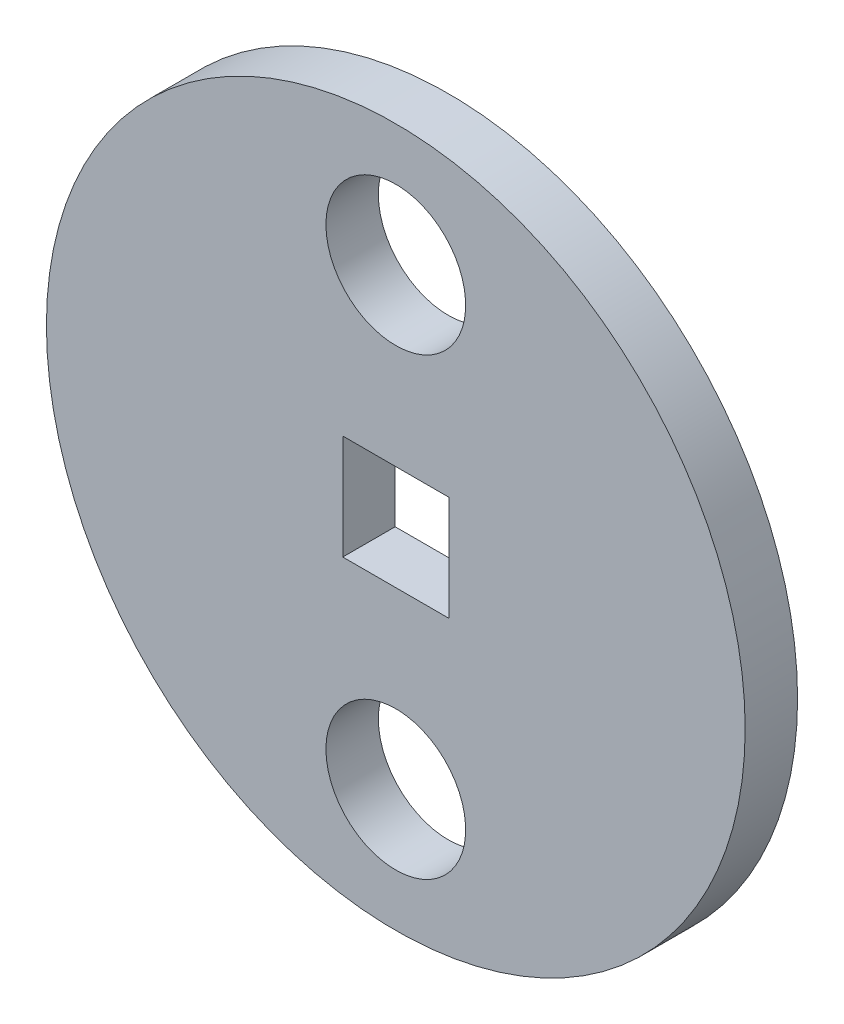
ISO-10303-21;
HEADER;
FILE_DESCRIPTION(('STEP AP214'),'2;1');
FILE_NAME('part.step','',(''),(''),'','','');
FILE_SCHEMA(('AUTOMOTIVE_DESIGN { 1 0 10303 214 1 1 1 1 }'));
ENDSEC;
DATA;
#1=APPLICATION_CONTEXT('core data for automotive mechanical design processes');
#2=APPLICATION_PROTOCOL_DEFINITION('international standard','automotive_design',2000,#1);
#3=PRODUCT_CONTEXT('',#1,'mechanical');
#4=PRODUCT('Part','Part','',(#3));
#5=PRODUCT_RELATED_PRODUCT_CATEGORY('part','',(#4));
#6=PRODUCT_DEFINITION_FORMATION('','',#4);
#7=PRODUCT_DEFINITION_CONTEXT('part definition',#1,'design');
#8=PRODUCT_DEFINITION('design','',#6,#7);
#9=PRODUCT_DEFINITION_SHAPE('','',#8);
#10=(LENGTH_UNIT() NAMED_UNIT(*) SI_UNIT(.MILLI.,.METRE.));
#11=(NAMED_UNIT(*) PLANE_ANGLE_UNIT() SI_UNIT($,.RADIAN.));
#12=(NAMED_UNIT(*) SI_UNIT($,.STERADIAN.) SOLID_ANGLE_UNIT());
#13=UNCERTAINTY_MEASURE_WITH_UNIT(LENGTH_MEASURE(1.E-05),#10,'distance_accuracy_value','');
#14=(GEOMETRIC_REPRESENTATION_CONTEXT(3) GLOBAL_UNCERTAINTY_ASSIGNED_CONTEXT((#13)) GLOBAL_UNIT_ASSIGNED_CONTEXT((#10,
#11,#12)) REPRESENTATION_CONTEXT('',''));
#15=CARTESIAN_POINT('',(0.,0.,0.));
#16=DIRECTION('',(0.,0.,1.));
#17=DIRECTION('',(1.,0.,0.));
#18=AXIS2_PLACEMENT_3D('',#15,#16,#17);
#19=CARTESIAN_POINT('',(0.,0.,3.81));
#20=DIRECTION('',(0.,0.,1.));
#21=DIRECTION('',(1.,0.,0.));
#22=AXIS2_PLACEMENT_3D('',#19,#20,#21);
#23=PLANE('',#22);
#24=CARTESIAN_POINT('',(0.,16.51,3.81));
#25=DIRECTION('',(0.,0.,1.));
#26=DIRECTION('',(1.,0.,0.));
#27=AXIS2_PLACEMENT_3D('',#24,#25,#26);
#28=CIRCLE('',#27,5.08);
#29=CARTESIAN_POINT('',(-5.08,16.51,3.81));
#30=VERTEX_POINT('',#29);
#31=EDGE_CURVE('E102',#30,#30,#28,.T.);
#32=ORIENTED_EDGE('',*,*,#31,.F.);
#33=EDGE_LOOP('',(#32));
#34=FACE_BOUND('',#33,.T.);
#35=CARTESIAN_POINT('',(0.,0.,3.81));
#36=DIRECTION('',(0.,0.,1.));
#37=DIRECTION('',(1.,0.,0.));
#38=AXIS2_PLACEMENT_3D('',#35,#36,#37);
#39=CIRCLE('',#38,25.4);
#40=CARTESIAN_POINT('',(-25.4,0.,3.81));
#41=VERTEX_POINT('',#40);
#42=EDGE_CURVE('E11',#41,#41,#39,.T.);
#43=ORIENTED_EDGE('',*,*,#42,.T.);
#44=EDGE_LOOP('',(#43));
#45=FACE_BOUND('',#44,.T.);
#46=DIRECTION('',(-1.,0.,0.));
#47=VECTOR('',#46,1.);
#48=CARTESIAN_POINT('',(-3.8553001339101,3.81,3.81));
#49=LINE('',#48,#47);
#50=CARTESIAN_POINT('',(3.8553001339101,3.81,3.81));
#51=VERTEX_POINT('',#50);
#52=CARTESIAN_POINT('',(-3.8553001339101,3.81,3.81));
#53=VERTEX_POINT('',#52);
#54=EDGE_CURVE('E82',#51,#53,#49,.T.);
#55=ORIENTED_EDGE('',*,*,#54,.F.);
#56=DIRECTION('',(0.,1.,0.));
#57=VECTOR('',#56,1.);
#58=CARTESIAN_POINT('',(3.8553001339101,3.81,3.81));
#59=LINE('',#58,#57);
#60=CARTESIAN_POINT('',(3.8553001339101,-3.81,3.81));
#61=VERTEX_POINT('',#60);
#62=EDGE_CURVE('E74',#61,#51,#59,.T.);
#63=ORIENTED_EDGE('',*,*,#62,.F.);
#64=DIRECTION('',(1.,0.,0.));
#65=VECTOR('',#64,1.);
#66=CARTESIAN_POINT('',(-3.8553001339101,-3.81,3.81));
#67=LINE('',#66,#65);
#68=CARTESIAN_POINT('',(-3.8553001339101,-3.81,3.81));
#69=VERTEX_POINT('',#68);
#70=EDGE_CURVE('E96',#69,#61,#67,.T.);
#71=ORIENTED_EDGE('',*,*,#70,.F.);
#72=DIRECTION('',(0.,-1.,0.));
#73=VECTOR('',#72,1.);
#74=CARTESIAN_POINT('',(-3.8553001339101,3.81,3.81));
#75=LINE('',#74,#73);
#76=EDGE_CURVE('E94',#53,#69,#75,.T.);
#77=ORIENTED_EDGE('',*,*,#76,.F.);
#78=EDGE_LOOP('',(#55,#63,#71,#77));
#79=FACE_BOUND('',#78,.T.);
#80=CARTESIAN_POINT('',(-1.11258653325771E-13,-16.51,3.81));
#81=DIRECTION('',(0.,0.,1.));
#82=DIRECTION('',(1.,0.,0.));
#83=AXIS2_PLACEMENT_3D('',#80,#81,#82);
#84=CIRCLE('',#83,5.08);
#85=CARTESIAN_POINT('',(-5.08000000000011,-16.51,3.81));
#86=VERTEX_POINT('',#85);
#87=EDGE_CURVE('E177',#86,#86,#84,.T.);
#88=ORIENTED_EDGE('',*,*,#87,.F.);
#89=EDGE_LOOP('',(#88));
#90=FACE_BOUND('',#89,.T.);
#91=ADVANCED_FACE('F33',(#34,#45,#79,#90),#23,.T.);
#92=CARTESIAN_POINT('',(0.,0.,0.));
#93=DIRECTION('',(0.,0.,1.));
#94=DIRECTION('',(1.,0.,0.));
#95=AXIS2_PLACEMENT_3D('',#92,#93,#94);
#96=PLANE('',#95);
#97=CARTESIAN_POINT('',(0.,0.,0.));
#98=DIRECTION('',(0.,0.,1.));
#99=DIRECTION('',(1.,0.,0.));
#100=AXIS2_PLACEMENT_3D('',#97,#98,#99);
#101=CIRCLE('',#100,25.4);
#102=CARTESIAN_POINT('',(-25.4,0.,0.));
#103=VERTEX_POINT('',#102);
#104=EDGE_CURVE('E37',#103,#103,#101,.T.);
#105=ORIENTED_EDGE('',*,*,#104,.F.);
#106=EDGE_LOOP('',(#105));
#107=FACE_BOUND('',#106,.T.);
#108=DIRECTION('',(0.,1.,0.));
#109=VECTOR('',#108,1.);
#110=CARTESIAN_POINT('',(3.8553001339101,3.81,0.));
#111=LINE('',#110,#109);
#112=CARTESIAN_POINT('',(3.8553001339101,-3.81,0.));
#113=VERTEX_POINT('',#112);
#114=CARTESIAN_POINT('',(3.8553001339101,3.81,0.));
#115=VERTEX_POINT('',#114);
#116=EDGE_CURVE('E56',#113,#115,#111,.T.);
#117=ORIENTED_EDGE('',*,*,#116,.T.);
#118=DIRECTION('',(-1.,0.,0.));
#119=VECTOR('',#118,1.);
#120=CARTESIAN_POINT('',(-3.8553001339101,3.81,0.));
#121=LINE('',#120,#119);
#122=CARTESIAN_POINT('',(-3.8553001339101,3.81,0.));
#123=VERTEX_POINT('',#122);
#124=EDGE_CURVE('E89',#115,#123,#121,.T.);
#125=ORIENTED_EDGE('',*,*,#124,.T.);
#126=DIRECTION('',(0.,-1.,0.));
#127=VECTOR('',#126,1.);
#128=CARTESIAN_POINT('',(-3.8553001339101,3.81,0.));
#129=LINE('',#128,#127);
#130=CARTESIAN_POINT('',(-3.8553001339101,-3.81,0.));
#131=VERTEX_POINT('',#130);
#132=EDGE_CURVE('E104',#123,#131,#129,.T.);
#133=ORIENTED_EDGE('',*,*,#132,.T.);
#134=DIRECTION('',(1.,0.,0.));
#135=VECTOR('',#134,1.);
#136=CARTESIAN_POINT('',(-3.8553001339101,-3.81,0.));
#137=LINE('',#136,#135);
#138=EDGE_CURVE('E83',#131,#113,#137,.T.);
#139=ORIENTED_EDGE('',*,*,#138,.T.);
#140=EDGE_LOOP('',(#117,#125,#133,#139));
#141=FACE_BOUND('',#140,.T.);
#142=CARTESIAN_POINT('',(0.,16.51,0.));
#143=DIRECTION('',(0.,0.,1.));
#144=DIRECTION('',(1.,0.,0.));
#145=AXIS2_PLACEMENT_3D('',#142,#143,#144);
#146=CIRCLE('',#145,5.08);
#147=CARTESIAN_POINT('',(-5.08,16.51,0.));
#148=VERTEX_POINT('',#147);
#149=EDGE_CURVE('E183',#148,#148,#146,.T.);
#150=ORIENTED_EDGE('',*,*,#149,.T.);
#151=EDGE_LOOP('',(#150));
#152=FACE_BOUND('',#151,.T.);
#153=CARTESIAN_POINT('',(-1.11258653325771E-13,-16.51,0.));
#154=DIRECTION('',(0.,0.,1.));
#155=DIRECTION('',(1.,0.,0.));
#156=AXIS2_PLACEMENT_3D('',#153,#154,#155);
#157=CIRCLE('',#156,5.08);
#158=CARTESIAN_POINT('',(-5.08000000000011,-16.51,0.));
#159=VERTEX_POINT('',#158);
#160=EDGE_CURVE('E180',#159,#159,#157,.T.);
#161=ORIENTED_EDGE('',*,*,#160,.T.);
#162=EDGE_LOOP('',(#161));
#163=FACE_BOUND('',#162,.T.);
#164=ADVANCED_FACE('F115',(#107,#141,#152,#163),#96,.F.);
#165=CARTESIAN_POINT('',(0.,0.,3.81));
#166=DIRECTION('',(0.,0.,-1.));
#167=DIRECTION('',(-1.,0.,0.));
#168=AXIS2_PLACEMENT_3D('',#165,#166,#167);
#169=CYLINDRICAL_SURFACE('',#168,25.4);
#170=CARTESIAN_POINT('',(-25.4,0.,3.81));
#171=CARTESIAN_POINT('',(-25.4,0.,3.7703125));
#172=CARTESIAN_POINT('',(-25.4,0.,3.730625));
#173=CARTESIAN_POINT('',(-25.4,0.,3.65125));
#174=CARTESIAN_POINT('',(-25.4,0.,3.6115625));
#175=CARTESIAN_POINT('',(-25.4,0.,3.5321875));
#176=CARTESIAN_POINT('',(-25.4,0.,3.4925));
#177=CARTESIAN_POINT('',(-25.4,0.,3.413125));
#178=CARTESIAN_POINT('',(-25.4,0.,3.3734375));
#179=CARTESIAN_POINT('',(-25.4,0.,3.2940625));
#180=CARTESIAN_POINT('',(-25.4,0.,3.254375));
#181=CARTESIAN_POINT('',(-25.4,0.,3.175));
#182=CARTESIAN_POINT('',(-25.4,0.,3.1353125));
#183=CARTESIAN_POINT('',(-25.4,0.,3.0559375));
#184=CARTESIAN_POINT('',(-25.4,0.,3.01625));
#185=CARTESIAN_POINT('',(-25.4,0.,2.936875));
#186=CARTESIAN_POINT('',(-25.4,0.,2.8971875));
#187=CARTESIAN_POINT('',(-25.4,0.,2.8178125));
#188=CARTESIAN_POINT('',(-25.4,0.,2.778125));
#189=CARTESIAN_POINT('',(-25.4,0.,2.69875));
#190=CARTESIAN_POINT('',(-25.4,0.,2.6590625));
#191=CARTESIAN_POINT('',(-25.4,0.,2.5796875));
#192=CARTESIAN_POINT('',(-25.4,0.,2.54));
#193=CARTESIAN_POINT('',(-25.4,0.,2.460625));
#194=CARTESIAN_POINT('',(-25.4,0.,2.4209375));
#195=CARTESIAN_POINT('',(-25.4,0.,2.3415625));
#196=CARTESIAN_POINT('',(-25.4,0.,2.301875));
#197=CARTESIAN_POINT('',(-25.4,0.,2.2225));
#198=CARTESIAN_POINT('',(-25.4,0.,2.1828125));
#199=CARTESIAN_POINT('',(-25.4,0.,2.1034375));
#200=CARTESIAN_POINT('',(-25.4,0.,2.06375));
#201=CARTESIAN_POINT('',(-25.4,0.,1.984375));
#202=CARTESIAN_POINT('',(-25.4,0.,1.9446875));
#203=CARTESIAN_POINT('',(-25.4,0.,1.8653125));
#204=CARTESIAN_POINT('',(-25.4,0.,1.825625));
#205=CARTESIAN_POINT('',(-25.4,0.,1.74625));
#206=CARTESIAN_POINT('',(-25.4,0.,1.7065625));
#207=CARTESIAN_POINT('',(-25.4,0.,1.6271875));
#208=CARTESIAN_POINT('',(-25.4,0.,1.5875));
#209=CARTESIAN_POINT('',(-25.4,0.,1.508125));
#210=CARTESIAN_POINT('',(-25.4,0.,1.4684375));
#211=CARTESIAN_POINT('',(-25.4,0.,1.3890625));
#212=CARTESIAN_POINT('',(-25.4,0.,1.349375));
#213=CARTESIAN_POINT('',(-25.4,0.,1.27));
#214=CARTESIAN_POINT('',(-25.4,0.,1.2303125));
#215=CARTESIAN_POINT('',(-25.4,0.,1.1509375));
#216=CARTESIAN_POINT('',(-25.4,0.,1.11125));
#217=CARTESIAN_POINT('',(-25.4,0.,1.031875));
#218=CARTESIAN_POINT('',(-25.4,0.,0.9921875));
#219=CARTESIAN_POINT('',(-25.4,0.,0.9128125));
#220=CARTESIAN_POINT('',(-25.4,0.,0.873125));
#221=CARTESIAN_POINT('',(-25.4,0.,0.79375));
#222=CARTESIAN_POINT('',(-25.4,0.,0.7540625));
#223=CARTESIAN_POINT('',(-25.4,0.,0.6746875));
#224=CARTESIAN_POINT('',(-25.4,0.,0.635));
#225=CARTESIAN_POINT('',(-25.4,0.,0.555625));
#226=CARTESIAN_POINT('',(-25.4,0.,0.5159375));
#227=CARTESIAN_POINT('',(-25.4,0.,0.4365625));
#228=CARTESIAN_POINT('',(-25.4,0.,0.396875));
#229=CARTESIAN_POINT('',(-25.4,0.,0.3175));
#230=CARTESIAN_POINT('',(-25.4,0.,0.2778125));
#231=CARTESIAN_POINT('',(-25.4,0.,0.1984375));
#232=CARTESIAN_POINT('',(-25.4,0.,0.15875));
#233=CARTESIAN_POINT('',(-25.4,0.,0.0793749999999999));
#234=CARTESIAN_POINT('',(-25.4,0.,0.0396874999999999));
#235=CARTESIAN_POINT('',(-25.4,0.,0.));
#236=B_SPLINE_CURVE_WITH_KNOTS('',3,(#170,#171,#172,#173,#174,#175,#176,#177,#178,#179,#180,
#181,#182,#183,#184,#185,#186,#187,#188,#189,#190,#191,#192,#193,#194,#195,#196,#197,#198,#199,
#200,#201,#202,#203,#204,#205,#206,#207,#208,#209,#210,#211,#212,#213,#214,#215,#216,#217,#218,
#219,#220,#221,#222,#223,#224,#225,#226,#227,#228,#229,#230,#231,#232,#233,#234,#235),
.UNSPECIFIED.,.F.,.F.,(4,2,2,2,2,2,2,2,2,2,2,2,2,2,2,2,2,2,2,2,2,2,2,2,2,2,2,2,2,2,2,2,4),(0.,
0.1190625,0.238125,0.3571875,0.47625,0.595312499999999,0.714375,0.833437499999999,
0.952499999999999,1.0715625,1.190625,1.3096875,1.42875,1.5478125,1.666875,1.7859375,1.905,
2.0240625,2.143125,2.2621875,2.38125,2.5003125,2.619375,2.7384375,2.8575,2.9765625,3.095625,
3.2146875,3.33375,3.4528125,3.571875,3.6909375,3.81),.UNSPECIFIED.);
#237=EDGE_CURVE('BSEAM35',#41,#103,#236,.T.);
#238=ORIENTED_EDGE('',*,*,#42,.F.);
#239=ORIENTED_EDGE('',*,*,#104,.T.);
#240=ORIENTED_EDGE('',*,*,#237,.T.);
#241=ORIENTED_EDGE('',*,*,#237,.F.);
#242=EDGE_LOOP('',(#238,#240,#239,#241));
#243=FACE_BOUND('',#242,.T.);
#244=ADVANCED_FACE('F35',(#243),#169,.T.);
#245=CARTESIAN_POINT('',(3.8553001339101,3.81,3.81));
#246=DIRECTION('',(-1.,0.,0.));
#247=DIRECTION('',(0.,-1.,0.));
#248=AXIS2_PLACEMENT_3D('',#245,#246,#247);
#249=PLANE('',#248);
#250=ORIENTED_EDGE('',*,*,#116,.F.);
#251=DIRECTION('',(0.,0.,-1.));
#252=VECTOR('',#251,1.);
#253=CARTESIAN_POINT('',(3.8553001339101,-3.81,3.81));
#254=LINE('',#253,#252);
#255=EDGE_CURVE('E78',#61,#113,#254,.T.);
#256=ORIENTED_EDGE('',*,*,#255,.F.);
#257=ORIENTED_EDGE('',*,*,#62,.T.);
#258=DIRECTION('',(0.,0.,-1.));
#259=VECTOR('',#258,1.);
#260=CARTESIAN_POINT('',(3.8553001339101,3.81,3.81));
#261=LINE('',#260,#259);
#262=EDGE_CURVE('E77',#51,#115,#261,.T.);
#263=ORIENTED_EDGE('',*,*,#262,.T.);
#264=EDGE_LOOP('',(#250,#256,#257,#263));
#265=FACE_BOUND('',#264,.T.);
#266=ADVANCED_FACE('F76',(#265),#249,.T.);
#267=CARTESIAN_POINT('',(-3.8553001339101,3.81,3.81));
#268=DIRECTION('',(0.,-1.,0.));
#269=DIRECTION('',(0.,0.,-1.));
#270=AXIS2_PLACEMENT_3D('',#267,#268,#269);
#271=PLANE('',#270);
#272=ORIENTED_EDGE('',*,*,#124,.F.);
#273=ORIENTED_EDGE('',*,*,#262,.F.);
#274=ORIENTED_EDGE('',*,*,#54,.T.);
#275=DIRECTION('',(0.,0.,-1.));
#276=VECTOR('',#275,1.);
#277=CARTESIAN_POINT('',(-3.8553001339101,3.81,3.81));
#278=LINE('',#277,#276);
#279=EDGE_CURVE('E90',#53,#123,#278,.T.);
#280=ORIENTED_EDGE('',*,*,#279,.T.);
#281=EDGE_LOOP('',(#272,#273,#274,#280));
#282=FACE_BOUND('',#281,.T.);
#283=ADVANCED_FACE('F86',(#282),#271,.T.);
#284=CARTESIAN_POINT('',(-3.8553001339101,3.81,3.81));
#285=DIRECTION('',(1.,0.,0.));
#286=DIRECTION('',(0.,1.,0.));
#287=AXIS2_PLACEMENT_3D('',#284,#285,#286);
#288=PLANE('',#287);
#289=ORIENTED_EDGE('',*,*,#132,.F.);
#290=ORIENTED_EDGE('',*,*,#279,.F.);
#291=ORIENTED_EDGE('',*,*,#76,.T.);
#292=DIRECTION('',(0.,0.,-1.));
#293=VECTOR('',#292,1.);
#294=CARTESIAN_POINT('',(-3.8553001339101,-3.81,3.81));
#295=LINE('',#294,#293);
#296=EDGE_CURVE('E48',#69,#131,#295,.T.);
#297=ORIENTED_EDGE('',*,*,#296,.T.);
#298=EDGE_LOOP('',(#289,#290,#291,#297));
#299=FACE_BOUND('',#298,.T.);
#300=ADVANCED_FACE('F113',(#299),#288,.T.);
#301=CARTESIAN_POINT('',(-3.8553001339101,-3.81,3.81));
#302=DIRECTION('',(0.,1.,0.));
#303=DIRECTION('',(0.,0.,1.));
#304=AXIS2_PLACEMENT_3D('',#301,#302,#303);
#305=PLANE('',#304);
#306=ORIENTED_EDGE('',*,*,#138,.F.);
#307=ORIENTED_EDGE('',*,*,#296,.F.);
#308=ORIENTED_EDGE('',*,*,#70,.T.);
#309=ORIENTED_EDGE('',*,*,#255,.T.);
#310=EDGE_LOOP('',(#306,#307,#308,#309));
#311=FACE_BOUND('',#310,.T.);
#312=ADVANCED_FACE('F117',(#311),#305,.T.);
#313=CARTESIAN_POINT('',(0.,16.51,3.81));
#314=DIRECTION('',(0.,0.,-1.));
#315=DIRECTION('',(-1.,0.,0.));
#316=AXIS2_PLACEMENT_3D('',#313,#314,#315);
#317=CYLINDRICAL_SURFACE('',#316,5.08);
#318=CARTESIAN_POINT('',(-5.08,16.51,3.81));
#319=CARTESIAN_POINT('',(-5.08,16.51,3.7703125));
#320=CARTESIAN_POINT('',(-5.08,16.51,3.730625));
#321=CARTESIAN_POINT('',(-5.08,16.51,3.65125));
#322=CARTESIAN_POINT('',(-5.08,16.51,3.6115625));
#323=CARTESIAN_POINT('',(-5.08,16.51,3.5321875));
#324=CARTESIAN_POINT('',(-5.08,16.51,3.4925));
#325=CARTESIAN_POINT('',(-5.08,16.51,3.413125));
#326=CARTESIAN_POINT('',(-5.08,16.51,3.3734375));
#327=CARTESIAN_POINT('',(-5.08,16.51,3.2940625));
#328=CARTESIAN_POINT('',(-5.08,16.51,3.254375));
#329=CARTESIAN_POINT('',(-5.08,16.51,3.175));
#330=CARTESIAN_POINT('',(-5.08,16.51,3.1353125));
#331=CARTESIAN_POINT('',(-5.08,16.51,3.0559375));
#332=CARTESIAN_POINT('',(-5.08,16.51,3.01625));
#333=CARTESIAN_POINT('',(-5.08,16.51,2.936875));
#334=CARTESIAN_POINT('',(-5.08,16.51,2.8971875));
#335=CARTESIAN_POINT('',(-5.08,16.51,2.8178125));
#336=CARTESIAN_POINT('',(-5.08,16.51,2.778125));
#337=CARTESIAN_POINT('',(-5.08,16.51,2.69875));
#338=CARTESIAN_POINT('',(-5.08,16.51,2.6590625));
#339=CARTESIAN_POINT('',(-5.08,16.51,2.5796875));
#340=CARTESIAN_POINT('',(-5.08,16.51,2.54));
#341=CARTESIAN_POINT('',(-5.08,16.51,2.460625));
#342=CARTESIAN_POINT('',(-5.08,16.51,2.4209375));
#343=CARTESIAN_POINT('',(-5.08,16.51,2.3415625));
#344=CARTESIAN_POINT('',(-5.08,16.51,2.301875));
#345=CARTESIAN_POINT('',(-5.08,16.51,2.2225));
#346=CARTESIAN_POINT('',(-5.08,16.51,2.1828125));
#347=CARTESIAN_POINT('',(-5.08,16.51,2.1034375));
#348=CARTESIAN_POINT('',(-5.08,16.51,2.06375));
#349=CARTESIAN_POINT('',(-5.08,16.51,1.984375));
#350=CARTESIAN_POINT('',(-5.08,16.51,1.9446875));
#351=CARTESIAN_POINT('',(-5.08,16.51,1.8653125));
#352=CARTESIAN_POINT('',(-5.08,16.51,1.825625));
#353=CARTESIAN_POINT('',(-5.08,16.51,1.74625));
#354=CARTESIAN_POINT('',(-5.08,16.51,1.7065625));
#355=CARTESIAN_POINT('',(-5.08,16.51,1.6271875));
#356=CARTESIAN_POINT('',(-5.08,16.51,1.5875));
#357=CARTESIAN_POINT('',(-5.08,16.51,1.508125));
#358=CARTESIAN_POINT('',(-5.08,16.51,1.4684375));
#359=CARTESIAN_POINT('',(-5.08,16.51,1.3890625));
#360=CARTESIAN_POINT('',(-5.08,16.51,1.349375));
#361=CARTESIAN_POINT('',(-5.08,16.51,1.27));
#362=CARTESIAN_POINT('',(-5.08,16.51,1.2303125));
#363=CARTESIAN_POINT('',(-5.08,16.51,1.1509375));
#364=CARTESIAN_POINT('',(-5.08,16.51,1.11125));
#365=CARTESIAN_POINT('',(-5.08,16.51,1.031875));
#366=CARTESIAN_POINT('',(-5.08,16.51,0.9921875));
#367=CARTESIAN_POINT('',(-5.08,16.51,0.9128125));
#368=CARTESIAN_POINT('',(-5.08,16.51,0.873125));
#369=CARTESIAN_POINT('',(-5.08,16.51,0.79375));
#370=CARTESIAN_POINT('',(-5.08,16.51,0.7540625));
#371=CARTESIAN_POINT('',(-5.08,16.51,0.6746875));
#372=CARTESIAN_POINT('',(-5.08,16.51,0.635));
#373=CARTESIAN_POINT('',(-5.08,16.51,0.555625));
#374=CARTESIAN_POINT('',(-5.08,16.51,0.5159375));
#375=CARTESIAN_POINT('',(-5.08,16.51,0.4365625));
#376=CARTESIAN_POINT('',(-5.08,16.51,0.396875));
#377=CARTESIAN_POINT('',(-5.08,16.51,0.3175));
#378=CARTESIAN_POINT('',(-5.08,16.51,0.2778125));
#379=CARTESIAN_POINT('',(-5.08,16.51,0.1984375));
#380=CARTESIAN_POINT('',(-5.08,16.51,0.15875));
#381=CARTESIAN_POINT('',(-5.08,16.51,0.0793749999999999));
#382=CARTESIAN_POINT('',(-5.08,16.51,0.0396874999999999));
#383=CARTESIAN_POINT('',(-5.08,16.51,0.));
#384=B_SPLINE_CURVE_WITH_KNOTS('',3,(#318,#319,#320,#321,#322,#323,#324,#325,#326,#327,#328,
#329,#330,#331,#332,#333,#334,#335,#336,#337,#338,#339,#340,#341,#342,#343,#344,#345,#346,#347,
#348,#349,#350,#351,#352,#353,#354,#355,#356,#357,#358,#359,#360,#361,#362,#363,#364,#365,#366,
#367,#368,#369,#370,#371,#372,#373,#374,#375,#376,#377,#378,#379,#380,#381,#382,#383),
.UNSPECIFIED.,.F.,.F.,(4,2,2,2,2,2,2,2,2,2,2,2,2,2,2,2,2,2,2,2,2,2,2,2,2,2,2,2,2,2,2,2,4),(0.,
0.1190625,0.238125,0.3571875,0.47625,0.5953125,0.714375,0.8334375,0.9525,1.0715625,1.190625,
1.3096875,1.42875,1.5478125,1.666875,1.7859375,1.905,2.0240625,2.143125,2.2621875,2.38125,
2.5003125,2.619375,2.7384375,2.8575,2.9765625,3.095625,3.2146875,3.33375,3.4528125,3.571875,
3.6909375,3.81),.UNSPECIFIED.);
#385=EDGE_CURVE('BSEAM119',#30,#148,#384,.T.);
#386=ORIENTED_EDGE('',*,*,#31,.T.);
#387=ORIENTED_EDGE('',*,*,#149,.F.);
#388=ORIENTED_EDGE('',*,*,#385,.T.);
#389=ORIENTED_EDGE('',*,*,#385,.F.);
#390=EDGE_LOOP('',(#386,#388,#387,#389));
#391=FACE_BOUND('',#390,.T.);
#392=ADVANCED_FACE('F119',(#391),#317,.F.);
#393=CARTESIAN_POINT('',(-1.11258653325771E-13,-16.51,3.81));
#394=DIRECTION('',(0.,0.,-1.));
#395=DIRECTION('',(-1.,0.,0.));
#396=AXIS2_PLACEMENT_3D('',#393,#394,#395);
#397=CYLINDRICAL_SURFACE('',#396,5.08);
#398=CARTESIAN_POINT('',(-5.08000000000011,-16.51,3.81));
#399=CARTESIAN_POINT('',(-5.08000000000011,-16.51,3.7703125));
#400=CARTESIAN_POINT('',(-5.08000000000011,-16.51,3.730625));
#401=CARTESIAN_POINT('',(-5.08000000000011,-16.51,3.65125));
#402=CARTESIAN_POINT('',(-5.08000000000011,-16.51,3.6115625));
#403=CARTESIAN_POINT('',(-5.08000000000011,-16.51,3.5321875));
#404=CARTESIAN_POINT('',(-5.08000000000011,-16.51,3.4925));
#405=CARTESIAN_POINT('',(-5.08000000000011,-16.51,3.413125));
#406=CARTESIAN_POINT('',(-5.08000000000011,-16.51,3.3734375));
#407=CARTESIAN_POINT('',(-5.08000000000011,-16.51,3.2940625));
#408=CARTESIAN_POINT('',(-5.08000000000011,-16.51,3.254375));
#409=CARTESIAN_POINT('',(-5.08000000000011,-16.51,3.175));
#410=CARTESIAN_POINT('',(-5.08000000000011,-16.51,3.1353125));
#411=CARTESIAN_POINT('',(-5.08000000000011,-16.51,3.0559375));
#412=CARTESIAN_POINT('',(-5.08000000000011,-16.51,3.01625));
#413=CARTESIAN_POINT('',(-5.08000000000011,-16.51,2.936875));
#414=CARTESIAN_POINT('',(-5.08000000000011,-16.51,2.8971875));
#415=CARTESIAN_POINT('',(-5.08000000000011,-16.51,2.8178125));
#416=CARTESIAN_POINT('',(-5.08000000000011,-16.51,2.778125));
#417=CARTESIAN_POINT('',(-5.08000000000011,-16.51,2.69875));
#418=CARTESIAN_POINT('',(-5.08000000000011,-16.51,2.6590625));
#419=CARTESIAN_POINT('',(-5.08000000000011,-16.51,2.5796875));
#420=CARTESIAN_POINT('',(-5.08000000000011,-16.51,2.54));
#421=CARTESIAN_POINT('',(-5.08000000000011,-16.51,2.460625));
#422=CARTESIAN_POINT('',(-5.08000000000011,-16.51,2.4209375));
#423=CARTESIAN_POINT('',(-5.08000000000011,-16.51,2.3415625));
#424=CARTESIAN_POINT('',(-5.08000000000011,-16.51,2.301875));
#425=CARTESIAN_POINT('',(-5.08000000000011,-16.51,2.2225));
#426=CARTESIAN_POINT('',(-5.08000000000011,-16.51,2.1828125));
#427=CARTESIAN_POINT('',(-5.08000000000011,-16.51,2.1034375));
#428=CARTESIAN_POINT('',(-5.08000000000011,-16.51,2.06375));
#429=CARTESIAN_POINT('',(-5.08000000000011,-16.51,1.984375));
#430=CARTESIAN_POINT('',(-5.08000000000011,-16.51,1.9446875));
#431=CARTESIAN_POINT('',(-5.08000000000011,-16.51,1.8653125));
#432=CARTESIAN_POINT('',(-5.08000000000011,-16.51,1.825625));
#433=CARTESIAN_POINT('',(-5.08000000000011,-16.51,1.74625));
#434=CARTESIAN_POINT('',(-5.08000000000011,-16.51,1.7065625));
#435=CARTESIAN_POINT('',(-5.08000000000011,-16.51,1.6271875));
#436=CARTESIAN_POINT('',(-5.08000000000011,-16.51,1.5875));
#437=CARTESIAN_POINT('',(-5.08000000000011,-16.51,1.508125));
#438=CARTESIAN_POINT('',(-5.08000000000011,-16.51,1.4684375));
#439=CARTESIAN_POINT('',(-5.08000000000011,-16.51,1.3890625));
#440=CARTESIAN_POINT('',(-5.08000000000011,-16.51,1.349375));
#441=CARTESIAN_POINT('',(-5.08000000000011,-16.51,1.27));
#442=CARTESIAN_POINT('',(-5.08000000000011,-16.51,1.2303125));
#443=CARTESIAN_POINT('',(-5.08000000000011,-16.51,1.1509375));
#444=CARTESIAN_POINT('',(-5.08000000000011,-16.51,1.11125));
#445=CARTESIAN_POINT('',(-5.08000000000011,-16.51,1.031875));
#446=CARTESIAN_POINT('',(-5.08000000000011,-16.51,0.9921875));
#447=CARTESIAN_POINT('',(-5.08000000000011,-16.51,0.9128125));
#448=CARTESIAN_POINT('',(-5.08000000000011,-16.51,0.873125));
#449=CARTESIAN_POINT('',(-5.08000000000011,-16.51,0.79375));
#450=CARTESIAN_POINT('',(-5.08000000000011,-16.51,0.7540625));
#451=CARTESIAN_POINT('',(-5.08000000000011,-16.51,0.6746875));
#452=CARTESIAN_POINT('',(-5.08000000000011,-16.51,0.635));
#453=CARTESIAN_POINT('',(-5.08000000000011,-16.51,0.555625));
#454=CARTESIAN_POINT('',(-5.08000000000011,-16.51,0.5159375));
#455=CARTESIAN_POINT('',(-5.08000000000011,-16.51,0.4365625));
#456=CARTESIAN_POINT('',(-5.08000000000011,-16.51,0.396875));
#457=CARTESIAN_POINT('',(-5.08000000000011,-16.51,0.3175));
#458=CARTESIAN_POINT('',(-5.08000000000011,-16.51,0.2778125));
#459=CARTESIAN_POINT('',(-5.08000000000011,-16.51,0.1984375));
#460=CARTESIAN_POINT('',(-5.08000000000011,-16.51,0.15875));
#461=CARTESIAN_POINT('',(-5.08000000000011,-16.51,0.0793749999999999));
#462=CARTESIAN_POINT('',(-5.08000000000011,-16.51,0.0396874999999999));
#463=CARTESIAN_POINT('',(-5.08000000000011,-16.51,0.));
#464=B_SPLINE_CURVE_WITH_KNOTS('',3,(#398,#399,#400,#401,#402,#403,#404,#405,#406,#407,#408,
#409,#410,#411,#412,#413,#414,#415,#416,#417,#418,#419,#420,#421,#422,#423,#424,#425,#426,#427,
#428,#429,#430,#431,#432,#433,#434,#435,#436,#437,#438,#439,#440,#441,#442,#443,#444,#445,#446,
#447,#448,#449,#450,#451,#452,#453,#454,#455,#456,#457,#458,#459,#460,#461,#462,#463),
.UNSPECIFIED.,.F.,.F.,(4,2,2,2,2,2,2,2,2,2,2,2,2,2,2,2,2,2,2,2,2,2,2,2,2,2,2,2,2,2,2,2,4),(0.,
0.1190625,0.238125,0.3571875,0.47625,0.5953125,0.714375,0.8334375,0.9525,1.0715625,1.190625,
1.3096875,1.42875,1.5478125,1.666875,1.7859375,1.905,2.0240625,2.143125,2.2621875,2.38125,
2.5003125,2.619375,2.7384375,2.8575,2.9765625,3.095625,3.2146875,3.33375,3.4528125,3.571875,
3.6909375,3.81),.UNSPECIFIED.);
#465=EDGE_CURVE('BSEAM125',#86,#159,#464,.T.);
#466=ORIENTED_EDGE('',*,*,#87,.T.);
#467=ORIENTED_EDGE('',*,*,#160,.F.);
#468=ORIENTED_EDGE('',*,*,#465,.T.);
#469=ORIENTED_EDGE('',*,*,#465,.F.);
#470=EDGE_LOOP('',(#466,#468,#467,#469));
#471=FACE_BOUND('',#470,.T.);
#472=ADVANCED_FACE('F125',(#471),#397,.F.);
#473=CLOSED_SHELL('',(#91,#164,#244,#266,#283,#300,#312,#392,#472));
#474=MANIFOLD_SOLID_BREP('B2',#473);
#475=ADVANCED_BREP_SHAPE_REPRESENTATION('',(#18,#474),#14);
#476=SHAPE_DEFINITION_REPRESENTATION(#9,#475);
ENDSEC;
END-ISO-10303-21;
